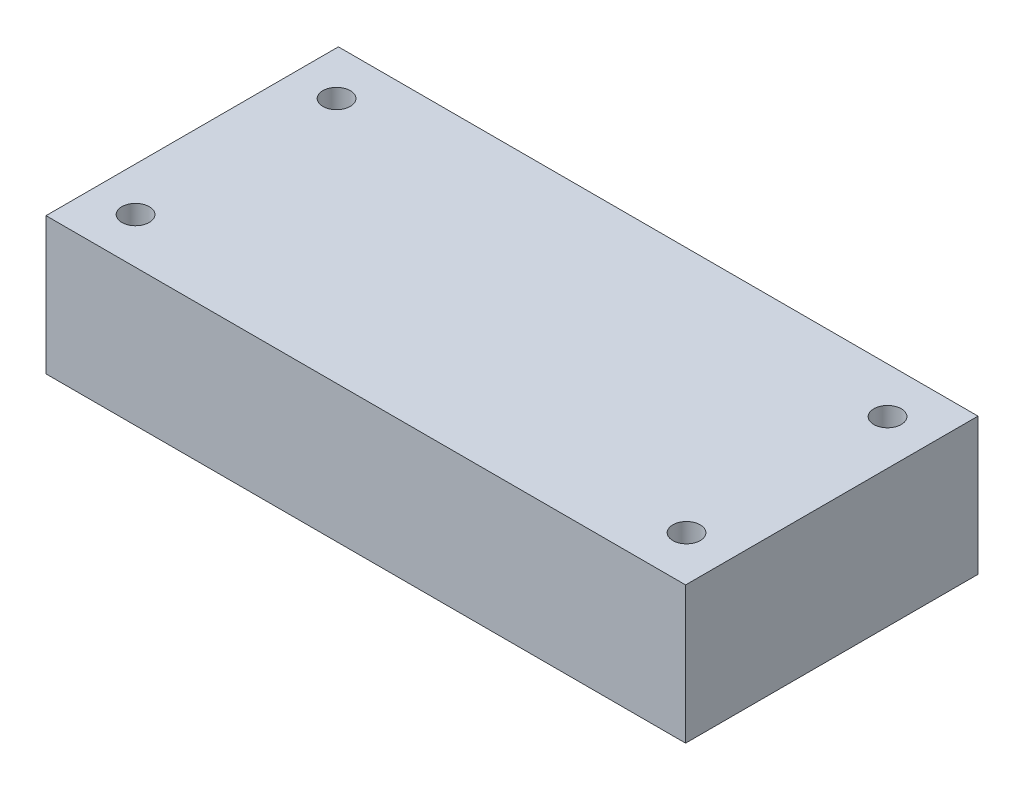
ISO-10303-21;
HEADER;
FILE_DESCRIPTION(('STEP AP214'),'2;1');
FILE_NAME('part.step','',(''),(''),'','','');
FILE_SCHEMA(('AUTOMOTIVE_DESIGN { 1 0 10303 214 1 1 1 1 }'));
ENDSEC;
DATA;
#1=APPLICATION_CONTEXT('core data for automotive mechanical design processes');
#2=APPLICATION_PROTOCOL_DEFINITION('international standard','automotive_design',2000,#1);
#3=PRODUCT_CONTEXT('',#1,'mechanical');
#4=PRODUCT('Part','Part','',(#3));
#5=PRODUCT_RELATED_PRODUCT_CATEGORY('part','',(#4));
#6=PRODUCT_DEFINITION_FORMATION('','',#4);
#7=PRODUCT_DEFINITION_CONTEXT('part definition',#1,'design');
#8=PRODUCT_DEFINITION('design','',#6,#7);
#9=PRODUCT_DEFINITION_SHAPE('','',#8);
#10=(LENGTH_UNIT() NAMED_UNIT(*) SI_UNIT(.MILLI.,.METRE.));
#11=(NAMED_UNIT(*) PLANE_ANGLE_UNIT() SI_UNIT($,.RADIAN.));
#12=(NAMED_UNIT(*) SI_UNIT($,.STERADIAN.) SOLID_ANGLE_UNIT());
#13=UNCERTAINTY_MEASURE_WITH_UNIT(LENGTH_MEASURE(1.E-05),#10,'distance_accuracy_value','');
#14=(GEOMETRIC_REPRESENTATION_CONTEXT(3) GLOBAL_UNCERTAINTY_ASSIGNED_CONTEXT((#13)) GLOBAL_UNIT_ASSIGNED_CONTEXT((#10,
#11,#12)) REPRESENTATION_CONTEXT('',''));
#15=CARTESIAN_POINT('',(0.,0.,0.));
#16=DIRECTION('',(0.,0.,1.));
#17=DIRECTION('',(1.,0.,0.));
#18=AXIS2_PLACEMENT_3D('',#15,#16,#17);
#19=CARTESIAN_POINT('',(0.,15.,0.));
#20=DIRECTION('',(0.,-1.,0.));
#21=DIRECTION('',(0.,0.,-1.));
#22=AXIS2_PLACEMENT_3D('',#19,#20,#21);
#23=PLANE('',#22);
#24=DIRECTION('',(0.,0.,-1.));
#25=VECTOR('',#24,1.);
#26=CARTESIAN_POINT('',(35.,15.,16.));
#27=LINE('',#26,#25);
#28=CARTESIAN_POINT('',(35.,15.,16.));
#29=VERTEX_POINT('',#28);
#30=CARTESIAN_POINT('',(35.,15.,-16.));
#31=VERTEX_POINT('',#30);
#32=EDGE_CURVE('E96',#29,#31,#27,.T.);
#33=ORIENTED_EDGE('',*,*,#32,.T.);
#34=DIRECTION('',(-1.,0.,0.));
#35=VECTOR('',#34,1.);
#36=CARTESIAN_POINT('',(-35.,15.,-16.));
#37=LINE('',#36,#35);
#38=CARTESIAN_POINT('',(-35.,15.,-16.));
#39=VERTEX_POINT('',#38);
#40=EDGE_CURVE('E91',#31,#39,#37,.T.);
#41=ORIENTED_EDGE('',*,*,#40,.T.);
#42=DIRECTION('',(0.,0.,1.));
#43=VECTOR('',#42,1.);
#44=CARTESIAN_POINT('',(-35.,15.,16.));
#45=LINE('',#44,#43);
#46=CARTESIAN_POINT('',(-35.,15.,16.));
#47=VERTEX_POINT('',#46);
#48=EDGE_CURVE('E94',#39,#47,#45,.T.);
#49=ORIENTED_EDGE('',*,*,#48,.T.);
#50=DIRECTION('',(1.,0.,0.));
#51=VECTOR('',#50,1.);
#52=CARTESIAN_POINT('',(-35.,15.,16.));
#53=LINE('',#52,#51);
#54=EDGE_CURVE('E61',#47,#29,#53,.T.);
#55=ORIENTED_EDGE('',*,*,#54,.T.);
#56=EDGE_LOOP('',(#33,#41,#49,#55));
#57=FACE_BOUND('',#56,.T.);
#58=CARTESIAN_POINT('',(-30.2,15.,-11.));
#59=DIRECTION('',(0.,1.,0.));
#60=DIRECTION('',(0.,0.,1.));
#61=AXIS2_PLACEMENT_3D('',#58,#59,#60);
#62=CIRCLE('',#61,1.5);
#63=CARTESIAN_POINT('',(-30.2,15.,-9.5));
#64=VERTEX_POINT('',#63);
#65=EDGE_CURVE('E116',#64,#64,#62,.T.);
#66=ORIENTED_EDGE('',*,*,#65,.F.);
#67=EDGE_LOOP('',(#66));
#68=FACE_BOUND('',#67,.T.);
#69=CARTESIAN_POINT('',(30.1,15.,-11.));
#70=DIRECTION('',(0.,1.,0.));
#71=DIRECTION('',(0.,0.,1.));
#72=AXIS2_PLACEMENT_3D('',#69,#70,#71);
#73=CIRCLE('',#72,1.50000000000001);
#74=CARTESIAN_POINT('',(30.1,15.,-9.49999999999999));
#75=VERTEX_POINT('',#74);
#76=EDGE_CURVE('E138',#75,#75,#73,.T.);
#77=ORIENTED_EDGE('',*,*,#76,.F.);
#78=EDGE_LOOP('',(#77));
#79=FACE_BOUND('',#78,.T.);
#80=CARTESIAN_POINT('',(30.1,15.,11.));
#81=DIRECTION('',(0.,1.,0.));
#82=DIRECTION('',(0.,0.,1.));
#83=AXIS2_PLACEMENT_3D('',#80,#81,#82);
#84=CIRCLE('',#83,1.5);
#85=CARTESIAN_POINT('',(30.1,15.,12.5));
#86=VERTEX_POINT('',#85);
#87=EDGE_CURVE('E146',#86,#86,#84,.T.);
#88=ORIENTED_EDGE('',*,*,#87,.F.);
#89=EDGE_LOOP('',(#88));
#90=FACE_BOUND('',#89,.T.);
#91=CARTESIAN_POINT('',(-30.2,15.,11.));
#92=DIRECTION('',(0.,1.,0.));
#93=DIRECTION('',(0.,0.,1.));
#94=AXIS2_PLACEMENT_3D('',#91,#92,#93);
#95=CIRCLE('',#94,1.5);
#96=CARTESIAN_POINT('',(-30.2,15.,12.5));
#97=VERTEX_POINT('',#96);
#98=EDGE_CURVE('E154',#97,#97,#95,.T.);
#99=ORIENTED_EDGE('',*,*,#98,.F.);
#100=EDGE_LOOP('',(#99));
#101=FACE_BOUND('',#100,.T.);
#102=ADVANCED_FACE('F43',(#57,#68,#79,#90,#101),#23,.F.);
#103=CARTESIAN_POINT('',(0.,0.,0.));
#104=DIRECTION('',(0.,-1.,0.));
#105=DIRECTION('',(0.,0.,-1.));
#106=AXIS2_PLACEMENT_3D('',#103,#104,#105);
#107=PLANE('',#106);
#108=CARTESIAN_POINT('',(30.1,0.,11.));
#109=DIRECTION('',(0.,1.,0.));
#110=DIRECTION('',(0.,0.,1.));
#111=AXIS2_PLACEMENT_3D('',#108,#109,#110);
#112=CIRCLE('',#111,1.5);
#113=CARTESIAN_POINT('',(30.1,0.,12.5));
#114=VERTEX_POINT('',#113);
#115=EDGE_CURVE('E150',#114,#114,#112,.T.);
#116=ORIENTED_EDGE('',*,*,#115,.T.);
#117=EDGE_LOOP('',(#116));
#118=FACE_BOUND('',#117,.T.);
#119=CARTESIAN_POINT('',(-30.2,0.,-11.));
#120=DIRECTION('',(0.,1.,0.));
#121=DIRECTION('',(0.,0.,1.));
#122=AXIS2_PLACEMENT_3D('',#119,#120,#121);
#123=CIRCLE('',#122,1.5);
#124=CARTESIAN_POINT('',(-30.2,0.,-9.5));
#125=VERTEX_POINT('',#124);
#126=EDGE_CURVE('E134',#125,#125,#123,.T.);
#127=ORIENTED_EDGE('',*,*,#126,.T.);
#128=EDGE_LOOP('',(#127));
#129=FACE_BOUND('',#128,.T.);
#130=DIRECTION('',(0.,0.,-1.));
#131=VECTOR('',#130,1.);
#132=CARTESIAN_POINT('',(35.,0.,16.));
#133=LINE('',#132,#131);
#134=CARTESIAN_POINT('',(35.,0.,16.));
#135=VERTEX_POINT('',#134);
#136=CARTESIAN_POINT('',(35.,0.,-16.));
#137=VERTEX_POINT('',#136);
#138=EDGE_CURVE('E112',#135,#137,#133,.T.);
#139=ORIENTED_EDGE('',*,*,#138,.F.);
#140=DIRECTION('',(1.,0.,0.));
#141=VECTOR('',#140,1.);
#142=CARTESIAN_POINT('',(-35.,0.,16.));
#143=LINE('',#142,#141);
#144=CARTESIAN_POINT('',(-35.,0.,16.));
#145=VERTEX_POINT('',#144);
#146=EDGE_CURVE('E84',#145,#135,#143,.T.);
#147=ORIENTED_EDGE('',*,*,#146,.F.);
#148=DIRECTION('',(0.,0.,1.));
#149=VECTOR('',#148,1.);
#150=CARTESIAN_POINT('',(-35.,0.,16.));
#151=LINE('',#150,#149);
#152=CARTESIAN_POINT('',(-35.,0.,-16.));
#153=VERTEX_POINT('',#152);
#154=EDGE_CURVE('E78',#153,#145,#151,.T.);
#155=ORIENTED_EDGE('',*,*,#154,.F.);
#156=DIRECTION('',(-1.,0.,0.));
#157=VECTOR('',#156,1.);
#158=CARTESIAN_POINT('',(-35.,0.,-16.));
#159=LINE('',#158,#157);
#160=EDGE_CURVE('E101',#137,#153,#159,.T.);
#161=ORIENTED_EDGE('',*,*,#160,.F.);
#162=EDGE_LOOP('',(#139,#147,#155,#161));
#163=FACE_BOUND('',#162,.T.);
#164=CARTESIAN_POINT('',(30.1,0.,-11.));
#165=DIRECTION('',(0.,1.,0.));
#166=DIRECTION('',(0.,0.,1.));
#167=AXIS2_PLACEMENT_3D('',#164,#165,#166);
#168=CIRCLE('',#167,1.50000000000001);
#169=CARTESIAN_POINT('',(30.1,0.,-9.49999999999999));
#170=VERTEX_POINT('',#169);
#171=EDGE_CURVE('E142',#170,#170,#168,.T.);
#172=ORIENTED_EDGE('',*,*,#171,.T.);
#173=EDGE_LOOP('',(#172));
#174=FACE_BOUND('',#173,.T.);
#175=CARTESIAN_POINT('',(-30.2,0.,11.));
#176=DIRECTION('',(0.,1.,0.));
#177=DIRECTION('',(0.,0.,1.));
#178=AXIS2_PLACEMENT_3D('',#175,#176,#177);
#179=CIRCLE('',#178,1.5);
#180=CARTESIAN_POINT('',(-30.2,0.,12.5));
#181=VERTEX_POINT('',#180);
#182=EDGE_CURVE('E158',#181,#181,#179,.T.);
#183=ORIENTED_EDGE('',*,*,#182,.T.);
#184=EDGE_LOOP('',(#183));
#185=FACE_BOUND('',#184,.T.);
#186=ADVANCED_FACE('F129',(#118,#129,#163,#174,#185),#107,.T.);
#187=CARTESIAN_POINT('',(35.,15.,16.));
#188=DIRECTION('',(-1.,0.,0.));
#189=DIRECTION('',(0.,0.,1.));
#190=AXIS2_PLACEMENT_3D('',#187,#188,#189);
#191=PLANE('',#190);
#192=ORIENTED_EDGE('',*,*,#138,.T.);
#193=DIRECTION('',(0.,-1.,0.));
#194=VECTOR('',#193,1.);
#195=CARTESIAN_POINT('',(35.,15.,-16.));
#196=LINE('',#195,#194);
#197=EDGE_CURVE('E11',#31,#137,#196,.T.);
#198=ORIENTED_EDGE('',*,*,#197,.F.);
#199=ORIENTED_EDGE('',*,*,#32,.F.);
#200=DIRECTION('',(0.,-1.,0.));
#201=VECTOR('',#200,1.);
#202=CARTESIAN_POINT('',(35.,15.,16.));
#203=LINE('',#202,#201);
#204=EDGE_CURVE('E108',#29,#135,#203,.T.);
#205=ORIENTED_EDGE('',*,*,#204,.T.);
#206=EDGE_LOOP('',(#192,#198,#199,#205));
#207=FACE_BOUND('',#206,.T.);
#208=ADVANCED_FACE('F45',(#207),#191,.F.);
#209=CARTESIAN_POINT('',(-35.,15.,-16.));
#210=DIRECTION('',(0.,0.,1.));
#211=DIRECTION('',(1.,0.,0.));
#212=AXIS2_PLACEMENT_3D('',#209,#210,#211);
#213=PLANE('',#212);
#214=ORIENTED_EDGE('',*,*,#160,.T.);
#215=DIRECTION('',(0.,-1.,0.));
#216=VECTOR('',#215,1.);
#217=CARTESIAN_POINT('',(-35.,15.,-16.));
#218=LINE('',#217,#216);
#219=EDGE_CURVE('E53',#39,#153,#218,.T.);
#220=ORIENTED_EDGE('',*,*,#219,.F.);
#221=ORIENTED_EDGE('',*,*,#40,.F.);
#222=ORIENTED_EDGE('',*,*,#197,.T.);
#223=EDGE_LOOP('',(#214,#220,#221,#222));
#224=FACE_BOUND('',#223,.T.);
#225=ADVANCED_FACE('F100',(#224),#213,.F.);
#226=CARTESIAN_POINT('',(-35.,15.,16.));
#227=DIRECTION('',(1.,0.,0.));
#228=DIRECTION('',(0.,0.,-1.));
#229=AXIS2_PLACEMENT_3D('',#226,#227,#228);
#230=PLANE('',#229);
#231=ORIENTED_EDGE('',*,*,#154,.T.);
#232=DIRECTION('',(0.,-1.,0.));
#233=VECTOR('',#232,1.);
#234=CARTESIAN_POINT('',(-35.,15.,16.));
#235=LINE('',#234,#233);
#236=EDGE_CURVE('E103',#47,#145,#235,.T.);
#237=ORIENTED_EDGE('',*,*,#236,.F.);
#238=ORIENTED_EDGE('',*,*,#48,.F.);
#239=ORIENTED_EDGE('',*,*,#219,.T.);
#240=EDGE_LOOP('',(#231,#237,#238,#239));
#241=FACE_BOUND('',#240,.T.);
#242=ADVANCED_FACE('F104',(#241),#230,.F.);
#243=CARTESIAN_POINT('',(-35.,15.,16.));
#244=DIRECTION('',(0.,0.,-1.));
#245=DIRECTION('',(-1.,0.,0.));
#246=AXIS2_PLACEMENT_3D('',#243,#244,#245);
#247=PLANE('',#246);
#248=ORIENTED_EDGE('',*,*,#146,.T.);
#249=ORIENTED_EDGE('',*,*,#204,.F.);
#250=ORIENTED_EDGE('',*,*,#54,.F.);
#251=ORIENTED_EDGE('',*,*,#236,.T.);
#252=EDGE_LOOP('',(#248,#249,#250,#251));
#253=FACE_BOUND('',#252,.T.);
#254=ADVANCED_FACE('F126',(#253),#247,.F.);
#255=CARTESIAN_POINT('',(-30.2,15.,-11.));
#256=DIRECTION('',(0.,-1.,0.));
#257=DIRECTION('',(0.,0.,-1.));
#258=AXIS2_PLACEMENT_3D('',#255,#256,#257);
#259=CYLINDRICAL_SURFACE('',#258,1.5);
#260=ORIENTED_EDGE('',*,*,#65,.T.);
#261=EDGE_LOOP('',(#260));
#262=FACE_BOUND('',#261,.T.);
#263=ORIENTED_EDGE('',*,*,#126,.F.);
#264=EDGE_LOOP('',(#263));
#265=FACE_BOUND('',#264,.T.);
#266=ADVANCED_FACE('F177',(#262,#265),#259,.F.);
#267=CARTESIAN_POINT('',(30.1,15.,-11.));
#268=DIRECTION('',(0.,-1.,0.));
#269=DIRECTION('',(0.,0.,-1.));
#270=AXIS2_PLACEMENT_3D('',#267,#268,#269);
#271=CYLINDRICAL_SURFACE('',#270,1.50000000000001);
#272=ORIENTED_EDGE('',*,*,#76,.T.);
#273=EDGE_LOOP('',(#272));
#274=FACE_BOUND('',#273,.T.);
#275=ORIENTED_EDGE('',*,*,#171,.F.);
#276=EDGE_LOOP('',(#275));
#277=FACE_BOUND('',#276,.T.);
#278=ADVANCED_FACE('F231',(#274,#277),#271,.F.);
#279=CARTESIAN_POINT('',(30.1,15.,11.));
#280=DIRECTION('',(0.,-1.,0.));
#281=DIRECTION('',(0.,0.,-1.));
#282=AXIS2_PLACEMENT_3D('',#279,#280,#281);
#283=CYLINDRICAL_SURFACE('',#282,1.5);
#284=ORIENTED_EDGE('',*,*,#87,.T.);
#285=EDGE_LOOP('',(#284));
#286=FACE_BOUND('',#285,.T.);
#287=ORIENTED_EDGE('',*,*,#115,.F.);
#288=EDGE_LOOP('',(#287));
#289=FACE_BOUND('',#288,.T.);
#290=ADVANCED_FACE('F240',(#286,#289),#283,.F.);
#291=CARTESIAN_POINT('',(-30.2,15.,11.));
#292=DIRECTION('',(0.,-1.,0.));
#293=DIRECTION('',(0.,0.,-1.));
#294=AXIS2_PLACEMENT_3D('',#291,#292,#293);
#295=CYLINDRICAL_SURFACE('',#294,1.5);
#296=ORIENTED_EDGE('',*,*,#98,.T.);
#297=EDGE_LOOP('',(#296));
#298=FACE_BOUND('',#297,.T.);
#299=ORIENTED_EDGE('',*,*,#182,.F.);
#300=EDGE_LOOP('',(#299));
#301=FACE_BOUND('',#300,.T.);
#302=ADVANCED_FACE('F166',(#298,#301),#295,.F.);
#303=CLOSED_SHELL('',(#102,#186,#208,#225,#242,#254,#266,#278,#290,#302));
#304=MANIFOLD_SOLID_BREP('B2',#303);
#305=ADVANCED_BREP_SHAPE_REPRESENTATION('',(#18,#304),#14);
#306=SHAPE_DEFINITION_REPRESENTATION(#9,#305);
ENDSEC;
END-ISO-10303-21;
